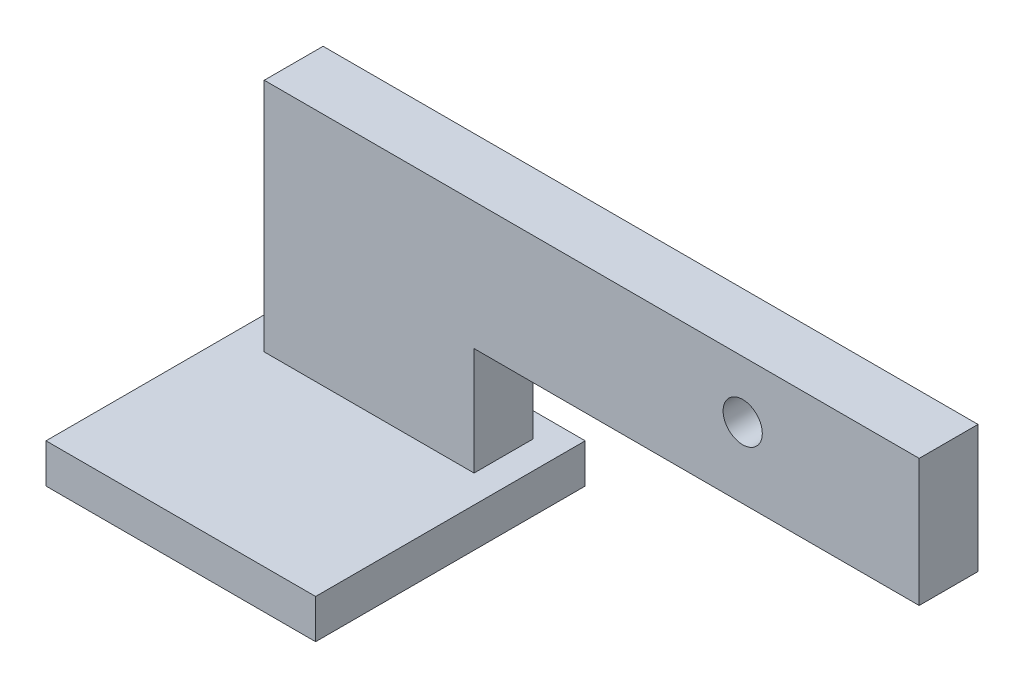
ISO-10303-21;
HEADER;
FILE_DESCRIPTION(('STEP AP214'),'2;1');
FILE_NAME('part.step','',(''),(''),'','','');
FILE_SCHEMA(('AUTOMOTIVE_DESIGN { 1 0 10303 214 1 1 1 1 }'));
ENDSEC;
DATA;
#1=APPLICATION_CONTEXT('core data for automotive mechanical design processes');
#2=APPLICATION_PROTOCOL_DEFINITION('international standard','automotive_design',2000,#1);
#3=PRODUCT_CONTEXT('',#1,'mechanical');
#4=PRODUCT('Part','Part','',(#3));
#5=PRODUCT_RELATED_PRODUCT_CATEGORY('part','',(#4));
#6=PRODUCT_DEFINITION_FORMATION('','',#4);
#7=PRODUCT_DEFINITION_CONTEXT('part definition',#1,'design');
#8=PRODUCT_DEFINITION('design','',#6,#7);
#9=PRODUCT_DEFINITION_SHAPE('','',#8);
#10=(LENGTH_UNIT() NAMED_UNIT(*) SI_UNIT(.MILLI.,.METRE.));
#11=(NAMED_UNIT(*) PLANE_ANGLE_UNIT() SI_UNIT($,.RADIAN.));
#12=(NAMED_UNIT(*) SI_UNIT($,.STERADIAN.) SOLID_ANGLE_UNIT());
#13=UNCERTAINTY_MEASURE_WITH_UNIT(LENGTH_MEASURE(1.E-05),#10,'distance_accuracy_value','');
#14=(GEOMETRIC_REPRESENTATION_CONTEXT(3) GLOBAL_UNCERTAINTY_ASSIGNED_CONTEXT((#13)) GLOBAL_UNIT_ASSIGNED_CONTEXT((#10,
#11,#12)) REPRESENTATION_CONTEXT('',''));
#15=CARTESIAN_POINT('',(0.,0.,0.));
#16=DIRECTION('',(0.,0.,1.));
#17=DIRECTION('',(1.,0.,0.));
#18=AXIS2_PLACEMENT_3D('',#15,#16,#17);
#19=CARTESIAN_POINT('',(-20.828,-25.4,139.573));
#20=DIRECTION('',(1.,0.,0.));
#21=DIRECTION('',(0.,0.,-1.));
#22=AXIS2_PLACEMENT_3D('',#19,#20,#21);
#23=PLANE('',#22);
#24=DIRECTION('',(0.,0.,-1.));
#25=VECTOR('',#24,1.);
#26=CARTESIAN_POINT('',(-20.828,0.,139.573));
#27=LINE('',#26,#25);
#28=CARTESIAN_POINT('',(-20.828,0.,139.573));
#29=VERTEX_POINT('',#28);
#30=CARTESIAN_POINT('',(-20.828,0.,-35.052));
#31=VERTEX_POINT('',#30);
#32=EDGE_CURVE('E110',#29,#31,#27,.T.);
#33=ORIENTED_EDGE('',*,*,#32,.T.);
#34=DIRECTION('',(0.,1.,0.));
#35=VECTOR('',#34,1.);
#36=CARTESIAN_POINT('',(-20.828,-25.4,-35.052));
#37=LINE('',#36,#35);
#38=CARTESIAN_POINT('',(-20.828,-25.4,-35.052));
#39=VERTEX_POINT('',#38);
#40=EDGE_CURVE('E12',#39,#31,#37,.T.);
#41=ORIENTED_EDGE('',*,*,#40,.F.);
#42=DIRECTION('',(0.,0.,-1.));
#43=VECTOR('',#42,1.);
#44=CARTESIAN_POINT('',(-20.828,-25.4,139.573));
#45=LINE('',#44,#43);
#46=CARTESIAN_POINT('',(-20.828,-25.4,139.573));
#47=VERTEX_POINT('',#46);
#48=EDGE_CURVE('E98',#47,#39,#45,.T.);
#49=ORIENTED_EDGE('',*,*,#48,.F.);
#50=DIRECTION('',(0.,1.,0.));
#51=VECTOR('',#50,1.);
#52=CARTESIAN_POINT('',(-20.828,-25.4,139.573));
#53=LINE('',#52,#51);
#54=EDGE_CURVE('E106',#47,#29,#53,.T.);
#55=ORIENTED_EDGE('',*,*,#54,.T.);
#56=EDGE_LOOP('',(#33,#41,#49,#55));
#57=FACE_BOUND('',#56,.T.);
#58=ADVANCED_FACE('F47',(#57),#23,.F.);
#59=CARTESIAN_POINT('',(-20.828,-25.4,-35.052));
#60=DIRECTION('',(0.,0.,1.));
#61=DIRECTION('',(1.,0.,0.));
#62=AXIS2_PLACEMENT_3D('',#59,#60,#61);
#63=PLANE('',#62);
#64=DIRECTION('',(1.,0.,0.));
#65=VECTOR('',#64,1.);
#66=CARTESIAN_POINT('',(-20.828,0.,-35.052));
#67=LINE('',#66,#65);
#68=CARTESIAN_POINT('',(153.797,0.,-35.052));
#69=VERTEX_POINT('',#68);
#70=EDGE_CURVE('E102',#31,#69,#67,.T.);
#71=ORIENTED_EDGE('',*,*,#70,.T.);
#72=DIRECTION('',(0.,1.,0.));
#73=VECTOR('',#72,1.);
#74=CARTESIAN_POINT('',(153.797,-25.4,-35.052));
#75=LINE('',#74,#73);
#76=CARTESIAN_POINT('',(153.797,-25.4,-35.052));
#77=VERTEX_POINT('',#76);
#78=EDGE_CURVE('E55',#77,#69,#75,.T.);
#79=ORIENTED_EDGE('',*,*,#78,.F.);
#80=DIRECTION('',(1.,0.,0.));
#81=VECTOR('',#80,1.);
#82=CARTESIAN_POINT('',(-20.828,-25.4,-35.052));
#83=LINE('',#82,#81);
#84=EDGE_CURVE('E93',#39,#77,#83,.T.);
#85=ORIENTED_EDGE('',*,*,#84,.F.);
#86=ORIENTED_EDGE('',*,*,#40,.T.);
#87=EDGE_LOOP('',(#71,#79,#85,#86));
#88=FACE_BOUND('',#87,.T.);
#89=ADVANCED_FACE('F101',(#88),#63,.F.);
#90=CARTESIAN_POINT('',(153.797,-25.4,139.573));
#91=DIRECTION('',(-1.,0.,0.));
#92=DIRECTION('',(0.,0.,1.));
#93=AXIS2_PLACEMENT_3D('',#90,#91,#92);
#94=PLANE('',#93);
#95=DIRECTION('',(0.,0.,1.));
#96=VECTOR('',#95,1.);
#97=CARTESIAN_POINT('',(153.797,0.,139.573));
#98=LINE('',#97,#96);
#99=CARTESIAN_POINT('',(153.797,0.,139.573));
#100=VERTEX_POINT('',#99);
#101=EDGE_CURVE('E80',#69,#100,#98,.T.);
#102=ORIENTED_EDGE('',*,*,#101,.T.);
#103=DIRECTION('',(0.,1.,0.));
#104=VECTOR('',#103,1.);
#105=CARTESIAN_POINT('',(153.797,-25.4,139.573));
#106=LINE('',#105,#104);
#107=CARTESIAN_POINT('',(153.797,-25.4,139.573));
#108=VERTEX_POINT('',#107);
#109=EDGE_CURVE('E103',#108,#100,#106,.T.);
#110=ORIENTED_EDGE('',*,*,#109,.F.);
#111=DIRECTION('',(0.,0.,1.));
#112=VECTOR('',#111,1.);
#113=CARTESIAN_POINT('',(153.797,-25.4,139.573));
#114=LINE('',#113,#112);
#115=EDGE_CURVE('E96',#77,#108,#114,.T.);
#116=ORIENTED_EDGE('',*,*,#115,.F.);
#117=ORIENTED_EDGE('',*,*,#78,.T.);
#118=EDGE_LOOP('',(#102,#110,#116,#117));
#119=FACE_BOUND('',#118,.T.);
#120=ADVANCED_FACE('F104',(#119),#94,.F.);
#121=CARTESIAN_POINT('',(-20.828,-25.4,139.573));
#122=DIRECTION('',(0.,0.,-1.));
#123=DIRECTION('',(-1.,0.,0.));
#124=AXIS2_PLACEMENT_3D('',#121,#122,#123);
#125=PLANE('',#124);
#126=DIRECTION('',(-1.,0.,0.));
#127=VECTOR('',#126,1.);
#128=CARTESIAN_POINT('',(-20.828,0.,139.573));
#129=LINE('',#128,#127);
#130=EDGE_CURVE('E86',#100,#29,#129,.T.);
#131=ORIENTED_EDGE('',*,*,#130,.T.);
#132=ORIENTED_EDGE('',*,*,#54,.F.);
#133=DIRECTION('',(-1.,0.,0.));
#134=VECTOR('',#133,1.);
#135=CARTESIAN_POINT('',(-20.828,-25.4,139.573));
#136=LINE('',#135,#134);
#137=EDGE_CURVE('E63',#108,#47,#136,.T.);
#138=ORIENTED_EDGE('',*,*,#137,.F.);
#139=ORIENTED_EDGE('',*,*,#109,.T.);
#140=EDGE_LOOP('',(#131,#132,#138,#139));
#141=FACE_BOUND('',#140,.T.);
#142=ADVANCED_FACE('F117',(#141),#125,.F.);
#143=CARTESIAN_POINT('',(0.,-25.4,0.));
#144=DIRECTION('',(0.,-1.,0.));
#145=DIRECTION('',(1.,0.,0.));
#146=AXIS2_PLACEMENT_3D('',#143,#144,#145);
#147=PLANE('',#146);
#148=ORIENTED_EDGE('',*,*,#48,.T.);
#149=ORIENTED_EDGE('',*,*,#84,.T.);
#150=ORIENTED_EDGE('',*,*,#115,.T.);
#151=ORIENTED_EDGE('',*,*,#137,.T.);
#152=EDGE_LOOP('',(#148,#149,#150,#151));
#153=FACE_BOUND('',#152,.T.);
#154=ADVANCED_FACE('F94',(#153),#147,.T.);
#155=CARTESIAN_POINT('',(0.,0.,0.));
#156=DIRECTION('',(0.,-1.,0.));
#157=DIRECTION('',(1.,0.,0.));
#158=AXIS2_PLACEMENT_3D('',#155,#156,#157);
#159=PLANE('',#158);
#160=ORIENTED_EDGE('',*,*,#32,.F.);
#161=ORIENTED_EDGE('',*,*,#130,.F.);
#162=ORIENTED_EDGE('',*,*,#101,.F.);
#163=ORIENTED_EDGE('',*,*,#70,.F.);
#164=EDGE_LOOP('',(#160,#161,#162,#163));
#165=FACE_BOUND('',#164,.T.);
#166=ADVANCED_FACE('F120',(#165),#159,.F.);
#167=CLOSED_SHELL('',(#58,#89,#120,#142,#154,#166));
#168=MANIFOLD_SOLID_BREP('B2',#167);
#169=CARTESIAN_POINT('',(135.89,0.,19.05));
#170=DIRECTION('',(0.,1.,0.));
#171=DIRECTION('',(-1.,0.,0.));
#172=AXIS2_PLACEMENT_3D('',#169,#170,#171);
#173=PLANE('',#172);
#174=DIRECTION('',(1.,0.,0.));
#175=VECTOR('',#174,1.);
#176=CARTESIAN_POINT('',(135.89,0.,-19.05));
#177=LINE('',#176,#175);
#178=CARTESIAN_POINT('',(0.,0.,-19.05));
#179=VERTEX_POINT('',#178);
#180=CARTESIAN_POINT('',(135.89,0.,-19.05));
#181=VERTEX_POINT('',#180);
#182=EDGE_CURVE('E255',#179,#181,#177,.T.);
#183=ORIENTED_EDGE('',*,*,#182,.T.);
#184=DIRECTION('',(0.,0.,-1.));
#185=VECTOR('',#184,1.);
#186=CARTESIAN_POINT('',(135.89,0.,19.05));
#187=LINE('',#186,#185);
#188=CARTESIAN_POINT('',(135.89,0.,19.05));
#189=VERTEX_POINT('',#188);
#190=EDGE_CURVE('E45',#189,#181,#187,.T.);
#191=ORIENTED_EDGE('',*,*,#190,.F.);
#192=DIRECTION('',(1.,0.,0.));
#193=VECTOR('',#192,1.);
#194=CARTESIAN_POINT('',(135.89,0.,19.05));
#195=LINE('',#194,#193);
#196=CARTESIAN_POINT('',(0.,0.,19.05));
#197=VERTEX_POINT('',#196);
#198=EDGE_CURVE('E266',#197,#189,#195,.T.);
#199=ORIENTED_EDGE('',*,*,#198,.F.);
#200=DIRECTION('',(0.,0.,-1.));
#201=VECTOR('',#200,1.);
#202=CARTESIAN_POINT('',(0.,0.,19.05));
#203=LINE('',#202,#201);
#204=EDGE_CURVE('E251',#197,#179,#203,.T.);
#205=ORIENTED_EDGE('',*,*,#204,.T.);
#206=EDGE_LOOP('',(#183,#191,#199,#205));
#207=FACE_BOUND('',#206,.T.);
#208=ADVANCED_FACE('F171',(#207),#173,.F.);
#209=CARTESIAN_POINT('',(135.89,69.85,19.05));
#210=DIRECTION('',(-1.,0.,0.));
#211=DIRECTION('',(0.,-1.,0.));
#212=AXIS2_PLACEMENT_3D('',#209,#210,#211);
#213=PLANE('',#212);
#214=DIRECTION('',(0.,1.,0.));
#215=VECTOR('',#214,1.);
#216=CARTESIAN_POINT('',(135.89,69.85,-19.05));
#217=LINE('',#216,#215);
#218=CARTESIAN_POINT('',(135.89,69.85,-19.05));
#219=VERTEX_POINT('',#218);
#220=EDGE_CURVE('E258',#181,#219,#217,.T.);
#221=ORIENTED_EDGE('',*,*,#220,.T.);
#222=DIRECTION('',(0.,0.,-1.));
#223=VECTOR('',#222,1.);
#224=CARTESIAN_POINT('',(135.89,69.85,19.05));
#225=LINE('',#224,#223);
#226=CARTESIAN_POINT('',(135.89,69.85,19.05));
#227=VERTEX_POINT('',#226);
#228=EDGE_CURVE('E179',#227,#219,#225,.T.);
#229=ORIENTED_EDGE('',*,*,#228,.F.);
#230=DIRECTION('',(0.,1.,0.));
#231=VECTOR('',#230,1.);
#232=CARTESIAN_POINT('',(135.89,69.85,19.05));
#233=LINE('',#232,#231);
#234=EDGE_CURVE('E224',#189,#227,#233,.T.);
#235=ORIENTED_EDGE('',*,*,#234,.F.);
#236=ORIENTED_EDGE('',*,*,#190,.T.);
#237=EDGE_LOOP('',(#221,#229,#235,#236));
#238=FACE_BOUND('',#237,.T.);
#239=ADVANCED_FACE('F292',(#238),#213,.F.);
#240=CARTESIAN_POINT('',(424.18,69.85,19.05));
#241=DIRECTION('',(0.,1.,0.));
#242=DIRECTION('',(-1.,0.,0.));
#243=AXIS2_PLACEMENT_3D('',#240,#241,#242);
#244=PLANE('',#243);
#245=DIRECTION('',(1.,0.,0.));
#246=VECTOR('',#245,1.);
#247=CARTESIAN_POINT('',(424.18,69.85,-19.05));
#248=LINE('',#247,#246);
#249=CARTESIAN_POINT('',(424.18,69.85,-19.05));
#250=VERTEX_POINT('',#249);
#251=EDGE_CURVE('E261',#219,#250,#248,.T.);
#252=ORIENTED_EDGE('',*,*,#251,.T.);
#253=DIRECTION('',(0.,0.,-1.));
#254=VECTOR('',#253,1.);
#255=CARTESIAN_POINT('',(424.18,69.85,19.05));
#256=LINE('',#255,#254);
#257=CARTESIAN_POINT('',(424.18,69.85,19.05));
#258=VERTEX_POINT('',#257);
#259=EDGE_CURVE('E246',#258,#250,#256,.T.);
#260=ORIENTED_EDGE('',*,*,#259,.F.);
#261=DIRECTION('',(1.,0.,0.));
#262=VECTOR('',#261,1.);
#263=CARTESIAN_POINT('',(424.18,69.85,19.05));
#264=LINE('',#263,#262);
#265=EDGE_CURVE('E237',#227,#258,#264,.T.);
#266=ORIENTED_EDGE('',*,*,#265,.F.);
#267=ORIENTED_EDGE('',*,*,#228,.T.);
#268=EDGE_LOOP('',(#252,#260,#266,#267));
#269=FACE_BOUND('',#268,.T.);
#270=ADVANCED_FACE('F272',(#269),#244,.F.);
#271=CARTESIAN_POINT('',(424.18,152.4,19.05));
#272=DIRECTION('',(-1.,0.,0.));
#273=DIRECTION('',(0.,0.,1.));
#274=AXIS2_PLACEMENT_3D('',#271,#272,#273);
#275=PLANE('',#274);
#276=DIRECTION('',(0.,1.,0.));
#277=VECTOR('',#276,1.);
#278=CARTESIAN_POINT('',(424.18,152.4,-19.05));
#279=LINE('',#278,#277);
#280=CARTESIAN_POINT('',(424.18,152.4,-19.05));
#281=VERTEX_POINT('',#280);
#282=EDGE_CURVE('E245',#250,#281,#279,.T.);
#283=ORIENTED_EDGE('',*,*,#282,.T.);
#284=DIRECTION('',(0.,0.,-1.));
#285=VECTOR('',#284,1.);
#286=CARTESIAN_POINT('',(424.18,152.4,19.05));
#287=LINE('',#286,#285);
#288=CARTESIAN_POINT('',(424.18,152.4,19.05));
#289=VERTEX_POINT('',#288);
#290=EDGE_CURVE('E242',#289,#281,#287,.T.);
#291=ORIENTED_EDGE('',*,*,#290,.F.);
#292=DIRECTION('',(0.,1.,0.));
#293=VECTOR('',#292,1.);
#294=CARTESIAN_POINT('',(424.18,152.4,19.05));
#295=LINE('',#294,#293);
#296=EDGE_CURVE('E231',#258,#289,#295,.T.);
#297=ORIENTED_EDGE('',*,*,#296,.F.);
#298=ORIENTED_EDGE('',*,*,#259,.T.);
#299=EDGE_LOOP('',(#283,#291,#297,#298));
#300=FACE_BOUND('',#299,.T.);
#301=ADVANCED_FACE('F243',(#300),#275,.F.);
#302=CARTESIAN_POINT('',(0.,152.4,19.05));
#303=DIRECTION('',(0.,-1.,0.));
#304=DIRECTION('',(0.,0.,-1.));
#305=AXIS2_PLACEMENT_3D('',#302,#303,#304);
#306=PLANE('',#305);
#307=DIRECTION('',(-1.,0.,0.));
#308=VECTOR('',#307,1.);
#309=CARTESIAN_POINT('',(0.,152.4,-19.05));
#310=LINE('',#309,#308);
#311=CARTESIAN_POINT('',(0.,152.4,-19.05));
#312=VERTEX_POINT('',#311);
#313=EDGE_CURVE('E210',#281,#312,#310,.T.);
#314=ORIENTED_EDGE('',*,*,#313,.T.);
#315=DIRECTION('',(0.,0.,-1.));
#316=VECTOR('',#315,1.);
#317=CARTESIAN_POINT('',(0.,152.4,19.05));
#318=LINE('',#317,#316);
#319=CARTESIAN_POINT('',(0.,152.4,19.05));
#320=VERTEX_POINT('',#319);
#321=EDGE_CURVE('E247',#320,#312,#318,.T.);
#322=ORIENTED_EDGE('',*,*,#321,.F.);
#323=DIRECTION('',(-1.,0.,0.));
#324=VECTOR('',#323,1.);
#325=CARTESIAN_POINT('',(0.,152.4,19.05));
#326=LINE('',#325,#324);
#327=EDGE_CURVE('E235',#289,#320,#326,.T.);
#328=ORIENTED_EDGE('',*,*,#327,.F.);
#329=ORIENTED_EDGE('',*,*,#290,.T.);
#330=EDGE_LOOP('',(#314,#322,#328,#329));
#331=FACE_BOUND('',#330,.T.);
#332=ADVANCED_FACE('F249',(#331),#306,.F.);
#333=CARTESIAN_POINT('',(0.,0.,19.05));
#334=DIRECTION('',(1.,0.,0.));
#335=DIRECTION('',(0.,0.,-1.));
#336=AXIS2_PLACEMENT_3D('',#333,#334,#335);
#337=PLANE('',#336);
#338=DIRECTION('',(0.,-1.,0.));
#339=VECTOR('',#338,1.);
#340=CARTESIAN_POINT('',(0.,0.,-19.05));
#341=LINE('',#340,#339);
#342=EDGE_CURVE('E216',#312,#179,#341,.T.);
#343=ORIENTED_EDGE('',*,*,#342,.T.);
#344=ORIENTED_EDGE('',*,*,#204,.F.);
#345=DIRECTION('',(0.,-1.,0.));
#346=VECTOR('',#345,1.);
#347=CARTESIAN_POINT('',(0.,0.,19.05));
#348=LINE('',#347,#346);
#349=EDGE_CURVE('E187',#320,#197,#348,.T.);
#350=ORIENTED_EDGE('',*,*,#349,.F.);
#351=ORIENTED_EDGE('',*,*,#321,.T.);
#352=EDGE_LOOP('',(#343,#344,#350,#351));
#353=FACE_BOUND('',#352,.T.);
#354=ADVANCED_FACE('F279',(#353),#337,.F.);
#355=CARTESIAN_POINT('',(0.,0.,19.05));
#356=DIRECTION('',(0.,0.,-1.));
#357=DIRECTION('',(-1.,0.,0.));
#358=AXIS2_PLACEMENT_3D('',#355,#356,#357);
#359=PLANE('',#358);
#360=CARTESIAN_POINT('',(309.88,115.57,19.05));
#361=DIRECTION('',(0.,0.,1.));
#362=DIRECTION('',(1.,0.,0.));
#363=AXIS2_PLACEMENT_3D('',#360,#361,#362);
#364=CIRCLE('',#363,12.7);
#365=CARTESIAN_POINT('',(322.58,115.57,19.05));
#366=VERTEX_POINT('',#365);
#367=EDGE_CURVE('E346',#366,#366,#364,.T.);
#368=ORIENTED_EDGE('',*,*,#367,.F.);
#369=EDGE_LOOP('',(#368));
#370=FACE_BOUND('',#369,.T.);
#371=ORIENTED_EDGE('',*,*,#198,.T.);
#372=ORIENTED_EDGE('',*,*,#234,.T.);
#373=ORIENTED_EDGE('',*,*,#265,.T.);
#374=ORIENTED_EDGE('',*,*,#296,.T.);
#375=ORIENTED_EDGE('',*,*,#327,.T.);
#376=ORIENTED_EDGE('',*,*,#349,.T.);
#377=EDGE_LOOP('',(#371,#372,#373,#374,#375,#376));
#378=FACE_BOUND('',#377,.T.);
#379=ADVANCED_FACE('F233',(#370,#378),#359,.F.);
#380=CARTESIAN_POINT('',(0.,0.,-19.05));
#381=DIRECTION('',(0.,0.,-1.));
#382=DIRECTION('',(-1.,0.,0.));
#383=AXIS2_PLACEMENT_3D('',#380,#381,#382);
#384=PLANE('',#383);
#385=CARTESIAN_POINT('',(309.88,115.57,-19.05));
#386=DIRECTION('',(0.,0.,1.));
#387=DIRECTION('',(1.,0.,0.));
#388=AXIS2_PLACEMENT_3D('',#385,#386,#387);
#389=CIRCLE('',#388,12.7);
#390=CARTESIAN_POINT('',(322.58,115.57,-19.05));
#391=VERTEX_POINT('',#390);
#392=EDGE_CURVE('E259',#391,#391,#389,.T.);
#393=ORIENTED_EDGE('',*,*,#392,.T.);
#394=EDGE_LOOP('',(#393));
#395=FACE_BOUND('',#394,.T.);
#396=ORIENTED_EDGE('',*,*,#182,.F.);
#397=ORIENTED_EDGE('',*,*,#342,.F.);
#398=ORIENTED_EDGE('',*,*,#313,.F.);
#399=ORIENTED_EDGE('',*,*,#282,.F.);
#400=ORIENTED_EDGE('',*,*,#251,.F.);
#401=ORIENTED_EDGE('',*,*,#220,.F.);
#402=EDGE_LOOP('',(#396,#397,#398,#399,#400,#401));
#403=FACE_BOUND('',#402,.T.);
#404=ADVANCED_FACE('F275',(#395,#403),#384,.T.);
#405=CARTESIAN_POINT('',(309.88,115.57,-19.05));
#406=DIRECTION('',(0.,0.,1.));
#407=DIRECTION('',(1.,0.,0.));
#408=AXIS2_PLACEMENT_3D('',#405,#406,#407);
#409=CYLINDRICAL_SURFACE('',#408,12.7);
#410=CARTESIAN_POINT('',(322.58,115.57,-19.05));
#411=CARTESIAN_POINT('',(322.58,115.57,-18.653125));
#412=CARTESIAN_POINT('',(322.58,115.57,-18.25625));
#413=CARTESIAN_POINT('',(322.58,115.57,-17.4625));
#414=CARTESIAN_POINT('',(322.58,115.57,-17.065625));
#415=CARTESIAN_POINT('',(322.58,115.57,-16.271875));
#416=CARTESIAN_POINT('',(322.58,115.57,-15.875));
#417=CARTESIAN_POINT('',(322.58,115.57,-15.08125));
#418=CARTESIAN_POINT('',(322.58,115.57,-14.684375));
#419=CARTESIAN_POINT('',(322.58,115.57,-13.890625));
#420=CARTESIAN_POINT('',(322.58,115.57,-13.49375));
#421=CARTESIAN_POINT('',(322.58,115.57,-12.7));
#422=CARTESIAN_POINT('',(322.58,115.57,-12.303125));
#423=CARTESIAN_POINT('',(322.58,115.57,-11.509375));
#424=CARTESIAN_POINT('',(322.58,115.57,-11.1125));
#425=CARTESIAN_POINT('',(322.58,115.57,-10.31875));
#426=CARTESIAN_POINT('',(322.58,115.57,-9.921875));
#427=CARTESIAN_POINT('',(322.58,115.57,-9.128125));
#428=CARTESIAN_POINT('',(322.58,115.57,-8.73125));
#429=CARTESIAN_POINT('',(322.58,115.57,-7.9375));
#430=CARTESIAN_POINT('',(322.58,115.57,-7.540625));
#431=CARTESIAN_POINT('',(322.58,115.57,-6.746875));
#432=CARTESIAN_POINT('',(322.58,115.57,-6.35));
#433=CARTESIAN_POINT('',(322.58,115.57,-5.55625));
#434=CARTESIAN_POINT('',(322.58,115.57,-5.159375));
#435=CARTESIAN_POINT('',(322.58,115.57,-4.365625));
#436=CARTESIAN_POINT('',(322.58,115.57,-3.96875));
#437=CARTESIAN_POINT('',(322.58,115.57,-3.175));
#438=CARTESIAN_POINT('',(322.58,115.57,-2.778125));
#439=CARTESIAN_POINT('',(322.58,115.57,-1.984375));
#440=CARTESIAN_POINT('',(322.58,115.57,-1.5875));
#441=CARTESIAN_POINT('',(322.58,115.57,-0.79375));
#442=CARTESIAN_POINT('',(322.58,115.57,-0.396875));
#443=CARTESIAN_POINT('',(322.58,115.57,0.396875));
#444=CARTESIAN_POINT('',(322.58,115.57,0.79375));
#445=CARTESIAN_POINT('',(322.58,115.57,1.5875));
#446=CARTESIAN_POINT('',(322.58,115.57,1.984375));
#447=CARTESIAN_POINT('',(322.58,115.57,2.778125));
#448=CARTESIAN_POINT('',(322.58,115.57,3.175));
#449=CARTESIAN_POINT('',(322.58,115.57,3.96875));
#450=CARTESIAN_POINT('',(322.58,115.57,4.365625));
#451=CARTESIAN_POINT('',(322.58,115.57,5.159375));
#452=CARTESIAN_POINT('',(322.58,115.57,5.55625));
#453=CARTESIAN_POINT('',(322.58,115.57,6.35));
#454=CARTESIAN_POINT('',(322.58,115.57,6.746875));
#455=CARTESIAN_POINT('',(322.58,115.57,7.540625));
#456=CARTESIAN_POINT('',(322.58,115.57,7.9375));
#457=CARTESIAN_POINT('',(322.58,115.57,8.73125));
#458=CARTESIAN_POINT('',(322.58,115.57,9.128125));
#459=CARTESIAN_POINT('',(322.58,115.57,9.921875));
#460=CARTESIAN_POINT('',(322.58,115.57,10.31875));
#461=CARTESIAN_POINT('',(322.58,115.57,11.1125));
#462=CARTESIAN_POINT('',(322.58,115.57,11.509375));
#463=CARTESIAN_POINT('',(322.58,115.57,12.303125));
#464=CARTESIAN_POINT('',(322.58,115.57,12.7));
#465=CARTESIAN_POINT('',(322.58,115.57,13.49375));
#466=CARTESIAN_POINT('',(322.58,115.57,13.890625));
#467=CARTESIAN_POINT('',(322.58,115.57,14.684375));
#468=CARTESIAN_POINT('',(322.58,115.57,15.08125));
#469=CARTESIAN_POINT('',(322.58,115.57,15.875));
#470=CARTESIAN_POINT('',(322.58,115.57,16.271875));
#471=CARTESIAN_POINT('',(322.58,115.57,17.065625));
#472=CARTESIAN_POINT('',(322.58,115.57,17.4625));
#473=CARTESIAN_POINT('',(322.58,115.57,18.25625));
#474=CARTESIAN_POINT('',(322.58,115.57,18.653125));
#475=CARTESIAN_POINT('',(322.58,115.57,19.05));
#476=B_SPLINE_CURVE_WITH_KNOTS('',3,(#410,#411,#412,#413,#414,#415,#416,#417,#418,#419,#420,
#421,#422,#423,#424,#425,#426,#427,#428,#429,#430,#431,#432,#433,#434,#435,#436,#437,#438,#439,
#440,#441,#442,#443,#444,#445,#446,#447,#448,#449,#450,#451,#452,#453,#454,#455,#456,#457,#458,
#459,#460,#461,#462,#463,#464,#465,#466,#467,#468,#469,#470,#471,#472,#473,#474,#475),
.UNSPECIFIED.,.F.,.F.,(4,2,2,2,2,2,2,2,2,2,2,2,2,2,2,2,2,2,2,2,2,2,2,2,2,2,2,2,2,2,2,2,4),(0.,
1.190625,2.38125,3.571875,4.7625,5.953125,7.14375,8.334375,9.525,10.715625,11.90625,13.096875,
14.2875,15.478125,16.66875,17.859375,19.05,20.240625,21.43125,22.621875,23.8125,25.003125,
26.19375,27.384375,28.575,29.765625,30.95625,32.146875,33.3375,34.528125,35.71875,36.909375,
38.1),.UNSPECIFIED.);
#477=EDGE_CURVE('BSEAM325',#391,#366,#476,.T.);
#478=ORIENTED_EDGE('',*,*,#392,.F.);
#479=ORIENTED_EDGE('',*,*,#367,.T.);
#480=ORIENTED_EDGE('',*,*,#477,.T.);
#481=ORIENTED_EDGE('',*,*,#477,.F.);
#482=EDGE_LOOP('',(#478,#480,#479,#481));
#483=FACE_BOUND('',#482,.T.);
#484=ADVANCED_FACE('F325',(#483),#409,.F.);
#485=CLOSED_SHELL('',(#208,#239,#270,#301,#332,#354,#379,#404,#484));
#486=MANIFOLD_SOLID_BREP('B6',#485);
#487=ADVANCED_BREP_SHAPE_REPRESENTATION('',(#18,#168,#486),#14);
#488=SHAPE_DEFINITION_REPRESENTATION(#9,#487);
ENDSEC;
END-ISO-10303-21;
